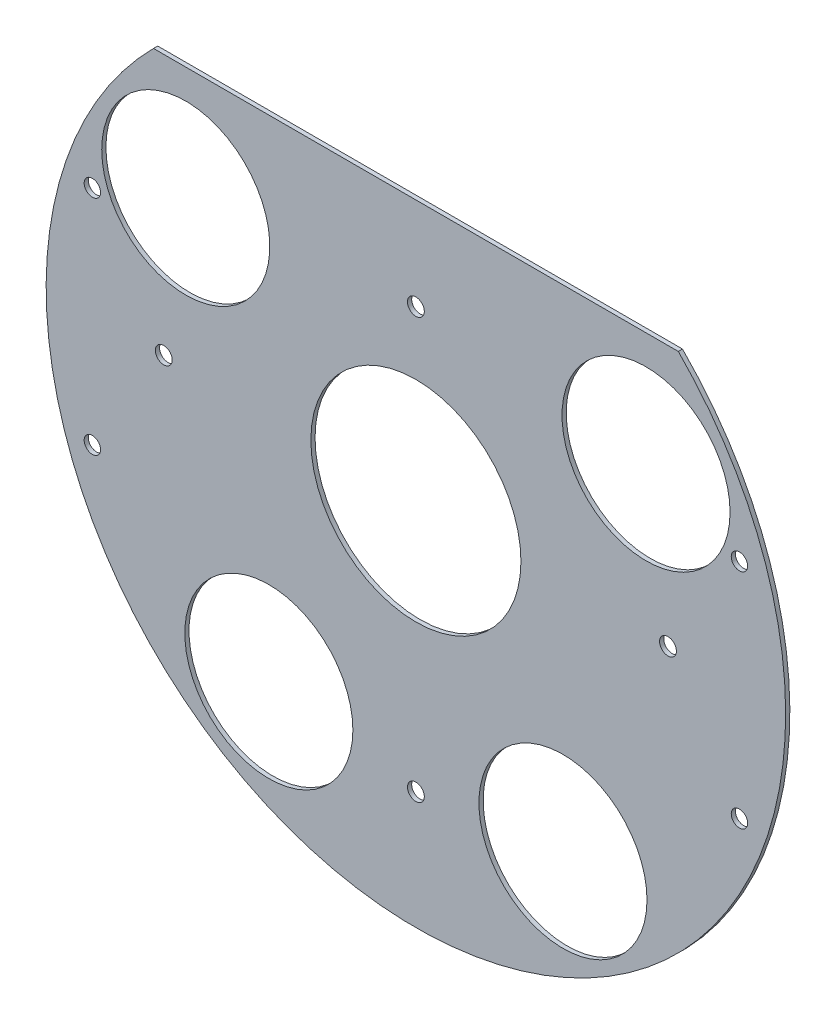
ISO-10303-21;
HEADER;
FILE_DESCRIPTION(('STEP AP214'),'2;1');
FILE_NAME('part.step','',(''),(''),'','','');
FILE_SCHEMA(('AUTOMOTIVE_DESIGN { 1 0 10303 214 1 1 1 1 }'));
ENDSEC;
DATA;
#1=APPLICATION_CONTEXT('core data for automotive mechanical design processes');
#2=APPLICATION_PROTOCOL_DEFINITION('international standard','automotive_design',2000,#1);
#3=PRODUCT_CONTEXT('',#1,'mechanical');
#4=PRODUCT('Part','Part','',(#3));
#5=PRODUCT_RELATED_PRODUCT_CATEGORY('part','',(#4));
#6=PRODUCT_DEFINITION_FORMATION('','',#4);
#7=PRODUCT_DEFINITION_CONTEXT('part definition',#1,'design');
#8=PRODUCT_DEFINITION('design','',#6,#7);
#9=PRODUCT_DEFINITION_SHAPE('','',#8);
#10=(LENGTH_UNIT() NAMED_UNIT(*) SI_UNIT(.MILLI.,.METRE.));
#11=(NAMED_UNIT(*) PLANE_ANGLE_UNIT() SI_UNIT($,.RADIAN.));
#12=(NAMED_UNIT(*) SI_UNIT($,.STERADIAN.) SOLID_ANGLE_UNIT());
#13=UNCERTAINTY_MEASURE_WITH_UNIT(LENGTH_MEASURE(1.E-05),#10,'distance_accuracy_value','');
#14=(GEOMETRIC_REPRESENTATION_CONTEXT(3) GLOBAL_UNCERTAINTY_ASSIGNED_CONTEXT((#13)) GLOBAL_UNIT_ASSIGNED_CONTEXT((#10,
#11,#12)) REPRESENTATION_CONTEXT('',''));
#15=CARTESIAN_POINT('',(0.,0.,0.));
#16=DIRECTION('',(0.,0.,1.));
#17=DIRECTION('',(1.,0.,0.));
#18=AXIS2_PLACEMENT_3D('',#15,#16,#17);
#19=CARTESIAN_POINT('',(0.,0.,1.));
#20=DIRECTION('',(0.,0.,1.));
#21=DIRECTION('',(1.,0.,0.));
#22=AXIS2_PLACEMENT_3D('',#19,#20,#21);
#23=PLANE('',#22);
#24=CARTESIAN_POINT('',(0.,-60.,1.));
#25=DIRECTION('',(0.,0.,1.));
#26=DIRECTION('',(1.,0.,0.));
#27=AXIS2_PLACEMENT_3D('',#24,#25,#26);
#28=CIRCLE('',#27,2.);
#29=CARTESIAN_POINT('',(2.,-60.,1.));
#30=VERTEX_POINT('',#29);
#31=EDGE_CURVE('E102',#30,#30,#28,.T.);
#32=ORIENTED_EDGE('',*,*,#31,.F.);
#33=EDGE_LOOP('',(#32));
#34=FACE_BOUND('',#33,.T.);
#35=CARTESIAN_POINT('',(60.,0.,1.));
#36=DIRECTION('',(0.,0.,1.));
#37=DIRECTION('',(1.,0.,0.));
#38=AXIS2_PLACEMENT_3D('',#35,#36,#37);
#39=CIRCLE('',#38,2.);
#40=CARTESIAN_POINT('',(62.,0.,1.));
#41=VERTEX_POINT('',#40);
#42=EDGE_CURVE('E92',#41,#41,#39,.T.);
#43=ORIENTED_EDGE('',*,*,#42,.F.);
#44=EDGE_LOOP('',(#43));
#45=FACE_BOUND('',#44,.T.);
#46=CARTESIAN_POINT('',(0.,40.,1.));
#47=DIRECTION('',(0.,0.,1.));
#48=DIRECTION('',(1.,0.,0.));
#49=AXIS2_PLACEMENT_3D('',#46,#47,#48);
#50=CIRCLE('',#49,2.);
#51=CARTESIAN_POINT('',(2.,40.,1.));
#52=VERTEX_POINT('',#51);
#53=EDGE_CURVE('E89',#52,#52,#50,.T.);
#54=ORIENTED_EDGE('',*,*,#53,.F.);
#55=EDGE_LOOP('',(#54));
#56=FACE_BOUND('',#55,.T.);
#57=CARTESIAN_POINT('',(-60.,0.,1.));
#58=DIRECTION('',(0.,0.,1.));
#59=DIRECTION('',(1.,0.,0.));
#60=AXIS2_PLACEMENT_3D('',#57,#58,#59);
#61=CIRCLE('',#60,2.);
#62=CARTESIAN_POINT('',(-58.,0.,1.));
#63=VERTEX_POINT('',#62);
#64=EDGE_CURVE('E86',#63,#63,#61,.T.);
#65=ORIENTED_EDGE('',*,*,#64,.F.);
#66=EDGE_LOOP('',(#65));
#67=FACE_BOUND('',#66,.T.);
#68=CARTESIAN_POINT('',(77.,26.,1.));
#69=DIRECTION('',(0.,0.,-1.));
#70=DIRECTION('',(-1.,0.,0.));
#71=AXIS2_PLACEMENT_3D('',#68,#69,#70);
#72=CIRCLE('',#71,1.94999999999999);
#73=CARTESIAN_POINT('',(75.05,26.,1.));
#74=VERTEX_POINT('',#73);
#75=EDGE_CURVE('E109',#74,#74,#72,.T.);
#76=ORIENTED_EDGE('',*,*,#75,.T.);
#77=EDGE_LOOP('',(#76));
#78=FACE_BOUND('',#77,.T.);
#79=CARTESIAN_POINT('',(77.,-27.,1.));
#80=DIRECTION('',(0.,0.,-1.));
#81=DIRECTION('',(-1.,0.,0.));
#82=AXIS2_PLACEMENT_3D('',#79,#80,#81);
#83=CIRCLE('',#82,1.94999999999999);
#84=CARTESIAN_POINT('',(75.05,-27.,1.));
#85=VERTEX_POINT('',#84);
#86=EDGE_CURVE('E115',#85,#85,#83,.T.);
#87=ORIENTED_EDGE('',*,*,#86,.T.);
#88=EDGE_LOOP('',(#87));
#89=FACE_BOUND('',#88,.T.);
#90=CARTESIAN_POINT('',(-77.,-27.,1.));
#91=DIRECTION('',(0.,0.,-1.));
#92=DIRECTION('',(-1.,0.,0.));
#93=AXIS2_PLACEMENT_3D('',#90,#91,#92);
#94=CIRCLE('',#93,1.94999999999999);
#95=CARTESIAN_POINT('',(-78.95,-27.,1.));
#96=VERTEX_POINT('',#95);
#97=EDGE_CURVE('E121',#96,#96,#94,.T.);
#98=ORIENTED_EDGE('',*,*,#97,.T.);
#99=EDGE_LOOP('',(#98));
#100=FACE_BOUND('',#99,.T.);
#101=CARTESIAN_POINT('',(-77.,26.,1.));
#102=DIRECTION('',(0.,0.,-1.));
#103=DIRECTION('',(-1.,0.,0.));
#104=AXIS2_PLACEMENT_3D('',#101,#102,#103);
#105=CIRCLE('',#104,1.94999999999999);
#106=CARTESIAN_POINT('',(-78.95,26.,1.));
#107=VERTEX_POINT('',#106);
#108=EDGE_CURVE('E127',#107,#107,#105,.T.);
#109=ORIENTED_EDGE('',*,*,#108,.T.);
#110=EDGE_LOOP('',(#109));
#111=FACE_BOUND('',#110,.T.);
#112=CARTESIAN_POINT('',(35.,-54.7722557505166,1.));
#113=DIRECTION('',(0.,0.,1.));
#114=DIRECTION('',(1.,0.,0.));
#115=AXIS2_PLACEMENT_3D('',#112,#113,#114);
#116=CIRCLE('',#115,20.);
#117=CARTESIAN_POINT('',(55.,-54.7722557505166,1.));
#118=VERTEX_POINT('',#117);
#119=EDGE_CURVE('E137',#118,#118,#116,.T.);
#120=ORIENTED_EDGE('',*,*,#119,.F.);
#121=EDGE_LOOP('',(#120));
#122=FACE_BOUND('',#121,.T.);
#123=CARTESIAN_POINT('',(54.772,35.,1.));
#124=DIRECTION('',(0.,0.,1.));
#125=DIRECTION('',(1.,0.,0.));
#126=AXIS2_PLACEMENT_3D('',#123,#124,#125);
#127=CIRCLE('',#126,20.);
#128=CARTESIAN_POINT('',(74.772,35.,1.));
#129=VERTEX_POINT('',#128);
#130=EDGE_CURVE('E149',#129,#129,#127,.T.);
#131=ORIENTED_EDGE('',*,*,#130,.F.);
#132=EDGE_LOOP('',(#131));
#133=FACE_BOUND('',#132,.T.);
#134=CARTESIAN_POINT('',(0.,0.,1.));
#135=DIRECTION('',(0.,0.,1.));
#136=DIRECTION('',(1.,0.,0.));
#137=AXIS2_PLACEMENT_3D('',#134,#135,#136);
#138=CIRCLE('',#137,88.);
#139=CARTESIAN_POINT('',(-62.449979983984,62.,1.));
#140=VERTEX_POINT('',#139);
#141=CARTESIAN_POINT('',(62.449979983984,62.,1.));
#142=VERTEX_POINT('',#141);
#143=EDGE_CURVE('E67',#140,#142,#138,.T.);
#144=ORIENTED_EDGE('',*,*,#143,.T.);
#145=DIRECTION('',(-1.,0.,0.));
#146=VECTOR('',#145,1.);
#147=CARTESIAN_POINT('',(-62.449979983984,62.,1.));
#148=LINE('',#147,#146);
#149=EDGE_CURVE('E52',#142,#140,#148,.T.);
#150=ORIENTED_EDGE('',*,*,#149,.T.);
#151=EDGE_LOOP('',(#144,#150));
#152=FACE_BOUND('',#151,.T.);
#153=CARTESIAN_POINT('',(0.,0.,1.));
#154=DIRECTION('',(0.,0.,1.));
#155=DIRECTION('',(1.,0.,0.));
#156=AXIS2_PLACEMENT_3D('',#153,#154,#155);
#157=CIRCLE('',#156,25.);
#158=CARTESIAN_POINT('',(25.,0.,1.));
#159=VERTEX_POINT('',#158);
#160=EDGE_CURVE('E74',#159,#159,#157,.T.);
#161=ORIENTED_EDGE('',*,*,#160,.F.);
#162=EDGE_LOOP('',(#161));
#163=FACE_BOUND('',#162,.T.);
#164=CARTESIAN_POINT('',(-54.772,35.,1.));
#165=DIRECTION('',(0.,0.,1.));
#166=DIRECTION('',(-1.,0.,0.));
#167=AXIS2_PLACEMENT_3D('',#164,#165,#166);
#168=CIRCLE('',#167,20.);
#169=CARTESIAN_POINT('',(-74.772,35.,1.));
#170=VERTEX_POINT('',#169);
#171=EDGE_CURVE('E143',#170,#170,#168,.T.);
#172=ORIENTED_EDGE('',*,*,#171,.F.);
#173=EDGE_LOOP('',(#172));
#174=FACE_BOUND('',#173,.T.);
#175=CARTESIAN_POINT('',(-35.,-54.7722557505166,1.));
#176=DIRECTION('',(0.,0.,1.));
#177=DIRECTION('',(1.,0.,0.));
#178=AXIS2_PLACEMENT_3D('',#175,#176,#177);
#179=CIRCLE('',#178,20.);
#180=CARTESIAN_POINT('',(-15.,-54.7722557505166,1.));
#181=VERTEX_POINT('',#180);
#182=EDGE_CURVE('E131',#181,#181,#179,.T.);
#183=ORIENTED_EDGE('',*,*,#182,.F.);
#184=EDGE_LOOP('',(#183));
#185=FACE_BOUND('',#184,.T.);
#186=ADVANCED_FACE('F34',(#34,#45,#56,#67,#78,#89,#100,#111,#122,#133,#152,#163,#174,#185),#23,.T.);
#187=CARTESIAN_POINT('',(0.,0.,0.));
#188=DIRECTION('',(0.,0.,1.));
#189=DIRECTION('',(1.,0.,0.));
#190=AXIS2_PLACEMENT_3D('',#187,#188,#189);
#191=PLANE('',#190);
#192=CARTESIAN_POINT('',(0.,-60.,0.));
#193=DIRECTION('',(0.,0.,1.));
#194=DIRECTION('',(1.,0.,0.));
#195=AXIS2_PLACEMENT_3D('',#192,#193,#194);
#196=CIRCLE('',#195,2.);
#197=CARTESIAN_POINT('',(2.,-60.,0.));
#198=VERTEX_POINT('',#197);
#199=EDGE_CURVE('E38',#198,#198,#196,.T.);
#200=ORIENTED_EDGE('',*,*,#199,.T.);
#201=EDGE_LOOP('',(#200));
#202=FACE_BOUND('',#201,.T.);
#203=CARTESIAN_POINT('',(60.,0.,0.));
#204=DIRECTION('',(0.,0.,1.));
#205=DIRECTION('',(1.,0.,0.));
#206=AXIS2_PLACEMENT_3D('',#203,#204,#205);
#207=CIRCLE('',#206,2.);
#208=CARTESIAN_POINT('',(62.,0.,0.));
#209=VERTEX_POINT('',#208);
#210=EDGE_CURVE('E90',#209,#209,#207,.T.);
#211=ORIENTED_EDGE('',*,*,#210,.T.);
#212=EDGE_LOOP('',(#211));
#213=FACE_BOUND('',#212,.T.);
#214=CARTESIAN_POINT('',(0.,40.,0.));
#215=DIRECTION('',(0.,0.,1.));
#216=DIRECTION('',(1.,0.,0.));
#217=AXIS2_PLACEMENT_3D('',#214,#215,#216);
#218=CIRCLE('',#217,2.);
#219=CARTESIAN_POINT('',(2.,40.,0.));
#220=VERTEX_POINT('',#219);
#221=EDGE_CURVE('E87',#220,#220,#218,.T.);
#222=ORIENTED_EDGE('',*,*,#221,.T.);
#223=EDGE_LOOP('',(#222));
#224=FACE_BOUND('',#223,.T.);
#225=CARTESIAN_POINT('',(-60.,0.,0.));
#226=DIRECTION('',(0.,0.,1.));
#227=DIRECTION('',(1.,0.,0.));
#228=AXIS2_PLACEMENT_3D('',#225,#226,#227);
#229=CIRCLE('',#228,2.);
#230=CARTESIAN_POINT('',(-58.,0.,0.));
#231=VERTEX_POINT('',#230);
#232=EDGE_CURVE('E82',#231,#231,#229,.T.);
#233=ORIENTED_EDGE('',*,*,#232,.T.);
#234=EDGE_LOOP('',(#233));
#235=FACE_BOUND('',#234,.T.);
#236=CARTESIAN_POINT('',(77.,26.,0.));
#237=DIRECTION('',(0.,0.,-1.));
#238=DIRECTION('',(-1.,0.,0.));
#239=AXIS2_PLACEMENT_3D('',#236,#237,#238);
#240=CIRCLE('',#239,1.94999999999999);
#241=CARTESIAN_POINT('',(75.05,26.,0.));
#242=VERTEX_POINT('',#241);
#243=EDGE_CURVE('E85',#242,#242,#240,.T.);
#244=ORIENTED_EDGE('',*,*,#243,.F.);
#245=EDGE_LOOP('',(#244));
#246=FACE_BOUND('',#245,.T.);
#247=CARTESIAN_POINT('',(77.,-27.,0.));
#248=DIRECTION('',(0.,0.,-1.));
#249=DIRECTION('',(-1.,0.,0.));
#250=AXIS2_PLACEMENT_3D('',#247,#248,#249);
#251=CIRCLE('',#250,1.94999999999999);
#252=CARTESIAN_POINT('',(75.05,-27.,0.));
#253=VERTEX_POINT('',#252);
#254=EDGE_CURVE('E112',#253,#253,#251,.T.);
#255=ORIENTED_EDGE('',*,*,#254,.F.);
#256=EDGE_LOOP('',(#255));
#257=FACE_BOUND('',#256,.T.);
#258=CARTESIAN_POINT('',(-77.,-27.,0.));
#259=DIRECTION('',(0.,0.,-1.));
#260=DIRECTION('',(-1.,0.,0.));
#261=AXIS2_PLACEMENT_3D('',#258,#259,#260);
#262=CIRCLE('',#261,1.94999999999999);
#263=CARTESIAN_POINT('',(-78.95,-27.,0.));
#264=VERTEX_POINT('',#263);
#265=EDGE_CURVE('E118',#264,#264,#262,.T.);
#266=ORIENTED_EDGE('',*,*,#265,.F.);
#267=EDGE_LOOP('',(#266));
#268=FACE_BOUND('',#267,.T.);
#269=CARTESIAN_POINT('',(-77.,26.,0.));
#270=DIRECTION('',(0.,0.,-1.));
#271=DIRECTION('',(-1.,0.,0.));
#272=AXIS2_PLACEMENT_3D('',#269,#270,#271);
#273=CIRCLE('',#272,1.94999999999999);
#274=CARTESIAN_POINT('',(-78.95,26.,0.));
#275=VERTEX_POINT('',#274);
#276=EDGE_CURVE('E124',#275,#275,#273,.T.);
#277=ORIENTED_EDGE('',*,*,#276,.F.);
#278=EDGE_LOOP('',(#277));
#279=FACE_BOUND('',#278,.T.);
#280=CARTESIAN_POINT('',(35.,-54.7722557505166,0.));
#281=DIRECTION('',(0.,0.,1.));
#282=DIRECTION('',(1.,0.,0.));
#283=AXIS2_PLACEMENT_3D('',#280,#281,#282);
#284=CIRCLE('',#283,20.);
#285=CARTESIAN_POINT('',(55.,-54.7722557505166,0.));
#286=VERTEX_POINT('',#285);
#287=EDGE_CURVE('E134',#286,#286,#284,.T.);
#288=ORIENTED_EDGE('',*,*,#287,.T.);
#289=EDGE_LOOP('',(#288));
#290=FACE_BOUND('',#289,.T.);
#291=CARTESIAN_POINT('',(54.772,35.,0.));
#292=DIRECTION('',(0.,0.,1.));
#293=DIRECTION('',(1.,0.,0.));
#294=AXIS2_PLACEMENT_3D('',#291,#292,#293);
#295=CIRCLE('',#294,20.);
#296=CARTESIAN_POINT('',(74.772,35.,0.));
#297=VERTEX_POINT('',#296);
#298=EDGE_CURVE('E146',#297,#297,#295,.T.);
#299=ORIENTED_EDGE('',*,*,#298,.T.);
#300=EDGE_LOOP('',(#299));
#301=FACE_BOUND('',#300,.T.);
#302=CARTESIAN_POINT('',(0.,0.,0.));
#303=DIRECTION('',(0.,0.,1.));
#304=DIRECTION('',(1.,0.,0.));
#305=AXIS2_PLACEMENT_3D('',#302,#303,#304);
#306=CIRCLE('',#305,88.);
#307=CARTESIAN_POINT('',(-62.449979983984,62.,0.));
#308=VERTEX_POINT('',#307);
#309=CARTESIAN_POINT('',(62.449979983984,62.,0.));
#310=VERTEX_POINT('',#309);
#311=EDGE_CURVE('E68',#308,#310,#306,.T.);
#312=ORIENTED_EDGE('',*,*,#311,.F.);
#313=DIRECTION('',(-1.,0.,0.));
#314=VECTOR('',#313,1.);
#315=CARTESIAN_POINT('',(-62.449979983984,62.,0.));
#316=LINE('',#315,#314);
#317=EDGE_CURVE('E60',#310,#308,#316,.T.);
#318=ORIENTED_EDGE('',*,*,#317,.F.);
#319=EDGE_LOOP('',(#312,#318));
#320=FACE_BOUND('',#319,.T.);
#321=CARTESIAN_POINT('',(0.,0.,0.));
#322=DIRECTION('',(0.,0.,1.));
#323=DIRECTION('',(1.,0.,0.));
#324=AXIS2_PLACEMENT_3D('',#321,#322,#323);
#325=CIRCLE('',#324,25.);
#326=CARTESIAN_POINT('',(25.,0.,0.));
#327=VERTEX_POINT('',#326);
#328=EDGE_CURVE('E77',#327,#327,#325,.T.);
#329=ORIENTED_EDGE('',*,*,#328,.T.);
#330=EDGE_LOOP('',(#329));
#331=FACE_BOUND('',#330,.T.);
#332=CARTESIAN_POINT('',(-54.772,35.,0.));
#333=DIRECTION('',(0.,0.,1.));
#334=DIRECTION('',(-1.,0.,0.));
#335=AXIS2_PLACEMENT_3D('',#332,#333,#334);
#336=CIRCLE('',#335,20.);
#337=CARTESIAN_POINT('',(-74.772,35.,0.));
#338=VERTEX_POINT('',#337);
#339=EDGE_CURVE('E140',#338,#338,#336,.T.);
#340=ORIENTED_EDGE('',*,*,#339,.T.);
#341=EDGE_LOOP('',(#340));
#342=FACE_BOUND('',#341,.T.);
#343=CARTESIAN_POINT('',(-35.,-54.7722557505166,0.));
#344=DIRECTION('',(0.,0.,1.));
#345=DIRECTION('',(1.,0.,0.));
#346=AXIS2_PLACEMENT_3D('',#343,#344,#345);
#347=CIRCLE('',#346,20.);
#348=CARTESIAN_POINT('',(-15.,-54.7722557505166,0.));
#349=VERTEX_POINT('',#348);
#350=EDGE_CURVE('E130',#349,#349,#347,.T.);
#351=ORIENTED_EDGE('',*,*,#350,.T.);
#352=EDGE_LOOP('',(#351));
#353=FACE_BOUND('',#352,.T.);
#354=ADVANCED_FACE('F72',(#202,#213,#224,#235,#246,#257,#268,#279,#290,#301,#320,#331,#342,
#353),#191,.F.);
#355=CARTESIAN_POINT('',(0.,0.,1.));
#356=DIRECTION('',(0.,0.,-1.));
#357=DIRECTION('',(-1.,0.,0.));
#358=AXIS2_PLACEMENT_3D('',#355,#356,#357);
#359=CYLINDRICAL_SURFACE('',#358,88.);
#360=ORIENTED_EDGE('',*,*,#311,.T.);
#361=DIRECTION('',(0.,0.,-1.));
#362=VECTOR('',#361,1.);
#363=CARTESIAN_POINT('',(62.449979983984,62.,1.));
#364=LINE('',#363,#362);
#365=EDGE_CURVE('E11',#142,#310,#364,.T.);
#366=ORIENTED_EDGE('',*,*,#365,.F.);
#367=ORIENTED_EDGE('',*,*,#143,.F.);
#368=DIRECTION('',(0.,0.,-1.));
#369=VECTOR('',#368,1.);
#370=CARTESIAN_POINT('',(-62.449979983984,62.,1.));
#371=LINE('',#370,#369);
#372=EDGE_CURVE('E44',#140,#308,#371,.T.);
#373=ORIENTED_EDGE('',*,*,#372,.T.);
#374=EDGE_LOOP('',(#360,#366,#367,#373));
#375=FACE_BOUND('',#374,.T.);
#376=ADVANCED_FACE('F36',(#375),#359,.T.);
#377=CARTESIAN_POINT('',(-62.449979983984,62.,1.));
#378=DIRECTION('',(0.,-1.,0.));
#379=DIRECTION('',(0.,0.,-1.));
#380=AXIS2_PLACEMENT_3D('',#377,#378,#379);
#381=PLANE('',#380);
#382=ORIENTED_EDGE('',*,*,#317,.T.);
#383=ORIENTED_EDGE('',*,*,#372,.F.);
#384=ORIENTED_EDGE('',*,*,#149,.F.);
#385=ORIENTED_EDGE('',*,*,#365,.T.);
#386=EDGE_LOOP('',(#382,#383,#384,#385));
#387=FACE_BOUND('',#386,.T.);
#388=ADVANCED_FACE('F63',(#387),#381,.F.);
#389=CARTESIAN_POINT('',(0.,0.,1.));
#390=DIRECTION('',(0.,0.,-1.));
#391=DIRECTION('',(-1.,0.,0.));
#392=AXIS2_PLACEMENT_3D('',#389,#390,#391);
#393=CYLINDRICAL_SURFACE('',#392,25.);
#394=ORIENTED_EDGE('',*,*,#160,.T.);
#395=EDGE_LOOP('',(#394));
#396=FACE_BOUND('',#395,.T.);
#397=ORIENTED_EDGE('',*,*,#328,.F.);
#398=EDGE_LOOP('',(#397));
#399=FACE_BOUND('',#398,.T.);
#400=ADVANCED_FACE('F181',(#396,#399),#393,.F.);
#401=CARTESIAN_POINT('',(54.772,35.,1.));
#402=DIRECTION('',(0.,0.,-1.));
#403=DIRECTION('',(-1.,0.,0.));
#404=AXIS2_PLACEMENT_3D('',#401,#402,#403);
#405=CYLINDRICAL_SURFACE('',#404,20.);
#406=ORIENTED_EDGE('',*,*,#130,.T.);
#407=EDGE_LOOP('',(#406));
#408=FACE_BOUND('',#407,.T.);
#409=ORIENTED_EDGE('',*,*,#298,.F.);
#410=EDGE_LOOP('',(#409));
#411=FACE_BOUND('',#410,.T.);
#412=ADVANCED_FACE('F185',(#408,#411),#405,.F.);
#413=CARTESIAN_POINT('',(-54.772,35.,1.));
#414=DIRECTION('',(0.,0.,-1.));
#415=DIRECTION('',(-1.,0.,0.));
#416=AXIS2_PLACEMENT_3D('',#413,#414,#415);
#417=CYLINDRICAL_SURFACE('',#416,20.);
#418=ORIENTED_EDGE('',*,*,#171,.T.);
#419=EDGE_LOOP('',(#418));
#420=FACE_BOUND('',#419,.T.);
#421=ORIENTED_EDGE('',*,*,#339,.F.);
#422=EDGE_LOOP('',(#421));
#423=FACE_BOUND('',#422,.T.);
#424=ADVANCED_FACE('F190',(#420,#423),#417,.F.);
#425=CARTESIAN_POINT('',(35.,-54.7722557505166,1.));
#426=DIRECTION('',(0.,0.,-1.));
#427=DIRECTION('',(-1.,0.,0.));
#428=AXIS2_PLACEMENT_3D('',#425,#426,#427);
#429=CYLINDRICAL_SURFACE('',#428,20.);
#430=ORIENTED_EDGE('',*,*,#119,.T.);
#431=EDGE_LOOP('',(#430));
#432=FACE_BOUND('',#431,.T.);
#433=ORIENTED_EDGE('',*,*,#287,.F.);
#434=EDGE_LOOP('',(#433));
#435=FACE_BOUND('',#434,.T.);
#436=ADVANCED_FACE('F169',(#432,#435),#429,.F.);
#437=CARTESIAN_POINT('',(-35.,-54.7722557505166,1.));
#438=DIRECTION('',(0.,0.,-1.));
#439=DIRECTION('',(-1.,0.,0.));
#440=AXIS2_PLACEMENT_3D('',#437,#438,#439);
#441=CYLINDRICAL_SURFACE('',#440,20.);
#442=ORIENTED_EDGE('',*,*,#182,.T.);
#443=EDGE_LOOP('',(#442));
#444=FACE_BOUND('',#443,.T.);
#445=ORIENTED_EDGE('',*,*,#350,.F.);
#446=EDGE_LOOP('',(#445));
#447=FACE_BOUND('',#446,.T.);
#448=ADVANCED_FACE('F165',(#444,#447),#441,.F.);
#449=CARTESIAN_POINT('',(-77.,26.,0.));
#450=DIRECTION('',(0.,0.,-1.));
#451=DIRECTION('',(-1.,0.,0.));
#452=AXIS2_PLACEMENT_3D('',#449,#450,#451);
#453=CYLINDRICAL_SURFACE('',#452,1.94999999999999);
#454=ORIENTED_EDGE('',*,*,#108,.F.);
#455=EDGE_LOOP('',(#454));
#456=FACE_BOUND('',#455,.T.);
#457=ORIENTED_EDGE('',*,*,#276,.T.);
#458=EDGE_LOOP('',(#457));
#459=FACE_BOUND('',#458,.T.);
#460=ADVANCED_FACE('F168',(#456,#459),#453,.F.);
#461=CARTESIAN_POINT('',(-77.,-27.,0.));
#462=DIRECTION('',(0.,0.,-1.));
#463=DIRECTION('',(-1.,0.,0.));
#464=AXIS2_PLACEMENT_3D('',#461,#462,#463);
#465=CYLINDRICAL_SURFACE('',#464,1.94999999999999);
#466=ORIENTED_EDGE('',*,*,#97,.F.);
#467=EDGE_LOOP('',(#466));
#468=FACE_BOUND('',#467,.T.);
#469=ORIENTED_EDGE('',*,*,#265,.T.);
#470=EDGE_LOOP('',(#469));
#471=FACE_BOUND('',#470,.T.);
#472=ADVANCED_FACE('F203',(#468,#471),#465,.F.);
#473=CARTESIAN_POINT('',(77.,-27.,0.));
#474=DIRECTION('',(0.,0.,-1.));
#475=DIRECTION('',(-1.,0.,0.));
#476=AXIS2_PLACEMENT_3D('',#473,#474,#475);
#477=CYLINDRICAL_SURFACE('',#476,1.94999999999999);
#478=ORIENTED_EDGE('',*,*,#86,.F.);
#479=EDGE_LOOP('',(#478));
#480=FACE_BOUND('',#479,.T.);
#481=ORIENTED_EDGE('',*,*,#254,.T.);
#482=EDGE_LOOP('',(#481));
#483=FACE_BOUND('',#482,.T.);
#484=ADVANCED_FACE('F207',(#480,#483),#477,.F.);
#485=CARTESIAN_POINT('',(77.,26.,0.));
#486=DIRECTION('',(0.,0.,-1.));
#487=DIRECTION('',(-1.,0.,0.));
#488=AXIS2_PLACEMENT_3D('',#485,#486,#487);
#489=CYLINDRICAL_SURFACE('',#488,1.94999999999999);
#490=ORIENTED_EDGE('',*,*,#75,.F.);
#491=EDGE_LOOP('',(#490));
#492=FACE_BOUND('',#491,.T.);
#493=ORIENTED_EDGE('',*,*,#243,.T.);
#494=EDGE_LOOP('',(#493));
#495=FACE_BOUND('',#494,.T.);
#496=ADVANCED_FACE('F211',(#492,#495),#489,.F.);
#497=CARTESIAN_POINT('',(-60.,0.,-9.));
#498=DIRECTION('',(0.,0.,1.));
#499=DIRECTION('',(1.,0.,0.));
#500=AXIS2_PLACEMENT_3D('',#497,#498,#499);
#501=CYLINDRICAL_SURFACE('',#500,2.);
#502=ORIENTED_EDGE('',*,*,#64,.T.);
#503=EDGE_LOOP('',(#502));
#504=FACE_BOUND('',#503,.T.);
#505=ORIENTED_EDGE('',*,*,#232,.F.);
#506=EDGE_LOOP('',(#505));
#507=FACE_BOUND('',#506,.T.);
#508=ADVANCED_FACE('F215',(#504,#507),#501,.F.);
#509=CARTESIAN_POINT('',(0.,40.,-9.));
#510=DIRECTION('',(0.,0.,1.));
#511=DIRECTION('',(1.,0.,0.));
#512=AXIS2_PLACEMENT_3D('',#509,#510,#511);
#513=CYLINDRICAL_SURFACE('',#512,2.);
#514=ORIENTED_EDGE('',*,*,#53,.T.);
#515=EDGE_LOOP('',(#514));
#516=FACE_BOUND('',#515,.T.);
#517=ORIENTED_EDGE('',*,*,#221,.F.);
#518=EDGE_LOOP('',(#517));
#519=FACE_BOUND('',#518,.T.);
#520=ADVANCED_FACE('F219',(#516,#519),#513,.F.);
#521=CARTESIAN_POINT('',(60.,0.,-9.));
#522=DIRECTION('',(0.,0.,1.));
#523=DIRECTION('',(1.,0.,0.));
#524=AXIS2_PLACEMENT_3D('',#521,#522,#523);
#525=CYLINDRICAL_SURFACE('',#524,2.);
#526=ORIENTED_EDGE('',*,*,#42,.T.);
#527=EDGE_LOOP('',(#526));
#528=FACE_BOUND('',#527,.T.);
#529=ORIENTED_EDGE('',*,*,#210,.F.);
#530=EDGE_LOOP('',(#529));
#531=FACE_BOUND('',#530,.T.);
#532=ADVANCED_FACE('F223',(#528,#531),#525,.F.);
#533=CARTESIAN_POINT('',(0.,-60.,-9.));
#534=DIRECTION('',(0.,0.,1.));
#535=DIRECTION('',(1.,0.,0.));
#536=AXIS2_PLACEMENT_3D('',#533,#534,#535);
#537=CYLINDRICAL_SURFACE('',#536,2.);
#538=ORIENTED_EDGE('',*,*,#31,.T.);
#539=EDGE_LOOP('',(#538));
#540=FACE_BOUND('',#539,.T.);
#541=ORIENTED_EDGE('',*,*,#199,.F.);
#542=EDGE_LOOP('',(#541));
#543=FACE_BOUND('',#542,.T.);
#544=ADVANCED_FACE('F227',(#540,#543),#537,.F.);
#545=CLOSED_SHELL('',(#186,#354,#376,#388,#400,#412,#424,#436,#448,#460,#472,#484,#496,#508,
#520,#532,#544));
#546=MANIFOLD_SOLID_BREP('B2',#545);
#547=ADVANCED_BREP_SHAPE_REPRESENTATION('',(#18,#546),#14);
#548=SHAPE_DEFINITION_REPRESENTATION(#9,#547);
ENDSEC;
END-ISO-10303-21;
